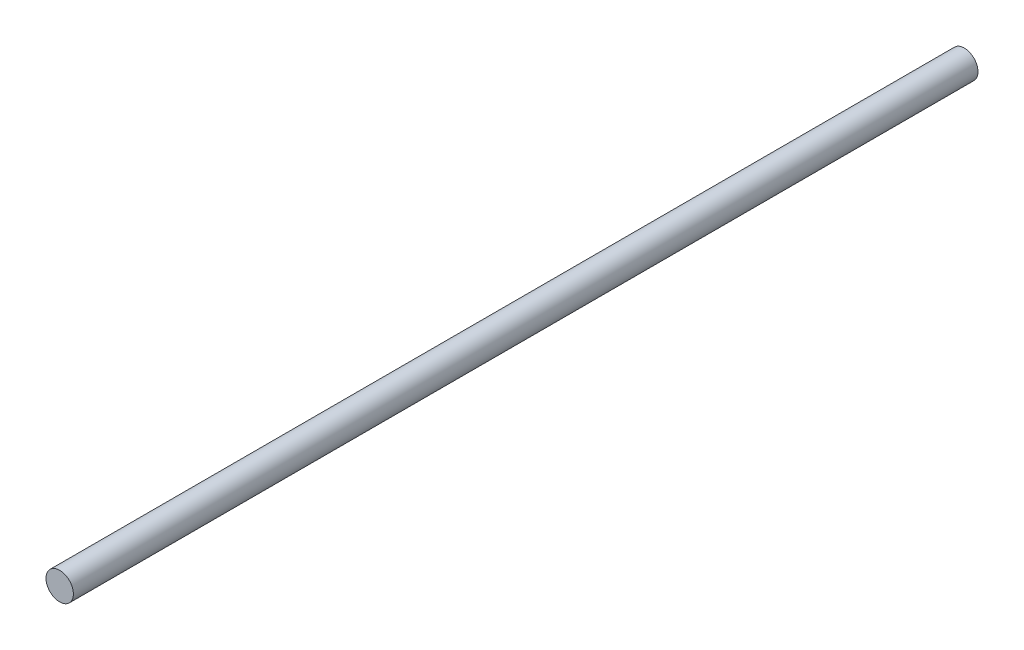
ISO-10303-21;
HEADER;
FILE_DESCRIPTION(('STEP AP214'),'2;1');
FILE_NAME('part.step','',(''),(''),'','','');
FILE_SCHEMA(('AUTOMOTIVE_DESIGN { 1 0 10303 214 1 1 1 1 }'));
ENDSEC;
DATA;
#1=APPLICATION_CONTEXT('core data for automotive mechanical design processes');
#2=APPLICATION_PROTOCOL_DEFINITION('international standard','automotive_design',2000,#1);
#3=PRODUCT_CONTEXT('',#1,'mechanical');
#4=PRODUCT('Part','Part','',(#3));
#5=PRODUCT_RELATED_PRODUCT_CATEGORY('part','',(#4));
#6=PRODUCT_DEFINITION_FORMATION('','',#4);
#7=PRODUCT_DEFINITION_CONTEXT('part definition',#1,'design');
#8=PRODUCT_DEFINITION('design','',#6,#7);
#9=PRODUCT_DEFINITION_SHAPE('','',#8);
#10=(LENGTH_UNIT() NAMED_UNIT(*) SI_UNIT(.MILLI.,.METRE.));
#11=(NAMED_UNIT(*) PLANE_ANGLE_UNIT() SI_UNIT($,.RADIAN.));
#12=(NAMED_UNIT(*) SI_UNIT($,.STERADIAN.) SOLID_ANGLE_UNIT());
#13=UNCERTAINTY_MEASURE_WITH_UNIT(LENGTH_MEASURE(1.E-05),#10,'distance_accuracy_value','');
#14=(GEOMETRIC_REPRESENTATION_CONTEXT(3) GLOBAL_UNCERTAINTY_ASSIGNED_CONTEXT((#13)) GLOBAL_UNIT_ASSIGNED_CONTEXT((#10,
#11,#12)) REPRESENTATION_CONTEXT('',''));
#15=CARTESIAN_POINT('',(0.,0.,0.));
#16=DIRECTION('',(0.,0.,1.));
#17=DIRECTION('',(1.,0.,0.));
#18=AXIS2_PLACEMENT_3D('',#15,#16,#17);
#19=CARTESIAN_POINT('',(0.,0.,165.));
#20=DIRECTION('',(0.,0.,-1.));
#21=DIRECTION('',(-1.,0.,0.));
#22=AXIS2_PLACEMENT_3D('',#19,#20,#21);
#23=CYLINDRICAL_SURFACE('',#22,2.5);
#24=CARTESIAN_POINT('',(0.,0.,165.));
#25=DIRECTION('',(0.,0.,1.));
#26=DIRECTION('',(1.,0.,0.));
#27=AXIS2_PLACEMENT_3D('',#24,#25,#26);
#28=CIRCLE('',#27,2.5);
#29=CARTESIAN_POINT('',(2.5,0.,165.));
#30=VERTEX_POINT('',#29);
#31=EDGE_CURVE('E10',#30,#30,#28,.T.);
#32=ORIENTED_EDGE('',*,*,#31,.F.);
#33=EDGE_LOOP('',(#32));
#34=FACE_BOUND('',#33,.T.);
#35=CARTESIAN_POINT('',(0.,0.,0.));
#36=DIRECTION('',(0.,0.,1.));
#37=DIRECTION('',(1.,0.,0.));
#38=AXIS2_PLACEMENT_3D('',#35,#36,#37);
#39=CIRCLE('',#38,2.5);
#40=CARTESIAN_POINT('',(2.5,0.,0.));
#41=VERTEX_POINT('',#40);
#42=EDGE_CURVE('E37',#41,#41,#39,.T.);
#43=ORIENTED_EDGE('',*,*,#42,.T.);
#44=EDGE_LOOP('',(#43));
#45=FACE_BOUND('',#44,.T.);
#46=ADVANCED_FACE('F34',(#34,#45),#23,.T.);
#47=CARTESIAN_POINT('',(0.,0.,165.));
#48=DIRECTION('',(0.,0.,1.));
#49=DIRECTION('',(1.,0.,0.));
#50=AXIS2_PLACEMENT_3D('',#47,#48,#49);
#51=PLANE('',#50);
#52=ORIENTED_EDGE('',*,*,#31,.T.);
#53=EDGE_LOOP('',(#52));
#54=FACE_BOUND('',#53,.T.);
#55=ADVANCED_FACE('F49',(#54),#51,.T.);
#56=CARTESIAN_POINT('',(0.,0.,0.));
#57=DIRECTION('',(0.,0.,1.));
#58=DIRECTION('',(1.,0.,0.));
#59=AXIS2_PLACEMENT_3D('',#56,#57,#58);
#60=PLANE('',#59);
#61=ORIENTED_EDGE('',*,*,#42,.F.);
#62=EDGE_LOOP('',(#61));
#63=FACE_BOUND('',#62,.T.);
#64=ADVANCED_FACE('F47',(#63),#60,.F.);
#65=CLOSED_SHELL('',(#46,#55,#64));
#66=MANIFOLD_SOLID_BREP('B2',#65);
#67=ADVANCED_BREP_SHAPE_REPRESENTATION('',(#18,#66),#14);
#68=SHAPE_DEFINITION_REPRESENTATION(#9,#67);
ENDSEC;
END-ISO-10303-21;
